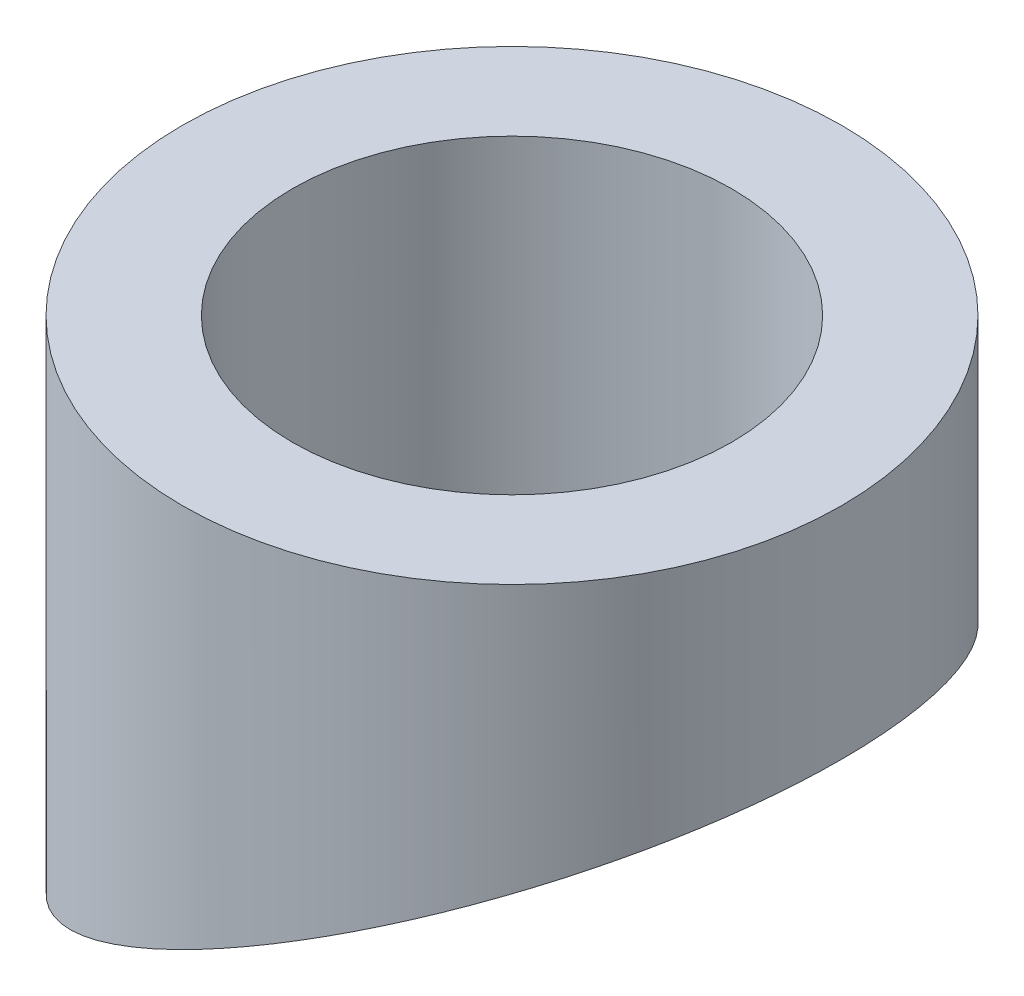
ISO-10303-21;
HEADER;
FILE_DESCRIPTION(('STEP AP214'),'2;1');
FILE_NAME('part.step','',(''),(''),'','','');
FILE_SCHEMA(('AUTOMOTIVE_DESIGN { 1 0 10303 214 1 1 1 1 }'));
ENDSEC;
DATA;
#1=APPLICATION_CONTEXT('core data for automotive mechanical design processes');
#2=APPLICATION_PROTOCOL_DEFINITION('international standard','automotive_design',2000,#1);
#3=PRODUCT_CONTEXT('',#1,'mechanical');
#4=PRODUCT('Part','Part','',(#3));
#5=PRODUCT_RELATED_PRODUCT_CATEGORY('part','',(#4));
#6=PRODUCT_DEFINITION_FORMATION('','',#4);
#7=PRODUCT_DEFINITION_CONTEXT('part definition',#1,'design');
#8=PRODUCT_DEFINITION('design','',#6,#7);
#9=PRODUCT_DEFINITION_SHAPE('','',#8);
#10=(LENGTH_UNIT() NAMED_UNIT(*) SI_UNIT(.MILLI.,.METRE.));
#11=(NAMED_UNIT(*) PLANE_ANGLE_UNIT() SI_UNIT($,.RADIAN.));
#12=(NAMED_UNIT(*) SI_UNIT($,.STERADIAN.) SOLID_ANGLE_UNIT());
#13=UNCERTAINTY_MEASURE_WITH_UNIT(LENGTH_MEASURE(1.E-05),#10,'distance_accuracy_value','');
#14=(GEOMETRIC_REPRESENTATION_CONTEXT(3) GLOBAL_UNCERTAINTY_ASSIGNED_CONTEXT((#13)) GLOBAL_UNIT_ASSIGNED_CONTEXT((#10,
#11,#12)) REPRESENTATION_CONTEXT('',''));
#15=CARTESIAN_POINT('',(0.,0.,0.));
#16=DIRECTION('',(0.,0.,1.));
#17=DIRECTION('',(1.,0.,0.));
#18=AXIS2_PLACEMENT_3D('',#15,#16,#17);
#19=CARTESIAN_POINT('',(0.,15.,0.));
#20=DIRECTION('',(0.,1.,0.));
#21=DIRECTION('',(0.,0.,1.));
#22=AXIS2_PLACEMENT_3D('',#19,#20,#21);
#23=PLANE('',#22);
#24=CARTESIAN_POINT('',(0.,15.,0.));
#25=DIRECTION('',(0.,1.,0.));
#26=DIRECTION('',(0.,0.,1.));
#27=AXIS2_PLACEMENT_3D('',#24,#25,#26);
#28=CIRCLE('',#27,9.);
#29=CARTESIAN_POINT('',(0.,15.,9.));
#30=VERTEX_POINT('',#29);
#31=EDGE_CURVE('E10',#30,#30,#28,.T.);
#32=ORIENTED_EDGE('',*,*,#31,.T.);
#33=EDGE_LOOP('',(#32));
#34=FACE_BOUND('',#33,.T.);
#35=CARTESIAN_POINT('',(0.,15.,0.));
#36=DIRECTION('',(0.,1.,0.));
#37=DIRECTION('',(0.,0.,1.));
#38=AXIS2_PLACEMENT_3D('',#35,#36,#37);
#39=CIRCLE('',#38,6.);
#40=CARTESIAN_POINT('',(0.,15.,6.));
#41=VERTEX_POINT('',#40);
#42=EDGE_CURVE('E46',#41,#41,#39,.T.);
#43=ORIENTED_EDGE('',*,*,#42,.F.);
#44=EDGE_LOOP('',(#43));
#45=FACE_BOUND('',#44,.T.);
#46=ADVANCED_FACE('F37',(#34,#45),#23,.T.);
#47=CARTESIAN_POINT('',(0.,15.,0.));
#48=DIRECTION('',(0.,-1.,0.));
#49=DIRECTION('',(0.,0.,-1.));
#50=AXIS2_PLACEMENT_3D('',#47,#48,#49);
#51=CYLINDRICAL_SURFACE('',#50,9.);
#52=ORIENTED_EDGE('',*,*,#31,.F.);
#53=EDGE_LOOP('',(#52));
#54=FACE_BOUND('',#53,.T.);
#55=CARTESIAN_POINT('',(0.,4.5,0.));
#56=DIRECTION('',(-0.447213595499958,0.894427190999916,0.));
#57=DIRECTION('',(-0.894427190999916,-0.447213595499958,0.));
#58=AXIS2_PLACEMENT_3D('',#55,#56,#57);
#59=ELLIPSE('',#58,10.0623058987491,9.);
#60=CARTESIAN_POINT('',(-9.,0.,0.));
#61=VERTEX_POINT('',#60);
#62=EDGE_CURVE('E51',#61,#61,#59,.T.);
#63=ORIENTED_EDGE('',*,*,#62,.T.);
#64=EDGE_LOOP('',(#63));
#65=FACE_BOUND('',#64,.T.);
#66=ADVANCED_FACE('F39',(#54,#65),#51,.T.);
#67=CARTESIAN_POINT('',(0.,15.,0.));
#68=DIRECTION('',(0.,-1.,0.));
#69=DIRECTION('',(0.,0.,-1.));
#70=AXIS2_PLACEMENT_3D('',#67,#68,#69);
#71=CYLINDRICAL_SURFACE('',#70,6.);
#72=CARTESIAN_POINT('',(0.,4.5,0.));
#73=DIRECTION('',(-0.447213595499958,0.894427190999916,0.));
#74=DIRECTION('',(-0.894427190999916,-0.447213595499958,0.));
#75=AXIS2_PLACEMENT_3D('',#72,#73,#74);
#76=ELLIPSE('',#75,6.70820393249937,6.);
#77=CARTESIAN_POINT('',(-6.,1.5,0.));
#78=VERTEX_POINT('',#77);
#79=EDGE_CURVE('E41',#78,#78,#76,.T.);
#80=ORIENTED_EDGE('',*,*,#79,.F.);
#81=EDGE_LOOP('',(#80));
#82=FACE_BOUND('',#81,.T.);
#83=ORIENTED_EDGE('',*,*,#42,.T.);
#84=EDGE_LOOP('',(#83));
#85=FACE_BOUND('',#84,.T.);
#86=ADVANCED_FACE('F65',(#82,#85),#71,.F.);
#87=CARTESIAN_POINT('',(-9.,0.,-15.));
#88=DIRECTION('',(-0.447213595499958,0.894427190999916,0.));
#89=DIRECTION('',(-0.894427190999916,-0.447213595499958,0.));
#90=AXIS2_PLACEMENT_3D('',#87,#88,#89);
#91=PLANE('',#90);
#92=ORIENTED_EDGE('',*,*,#79,.T.);
#93=EDGE_LOOP('',(#92));
#94=FACE_BOUND('',#93,.T.);
#95=ORIENTED_EDGE('',*,*,#62,.F.);
#96=EDGE_LOOP('',(#95));
#97=FACE_BOUND('',#96,.T.);
#98=ADVANCED_FACE('F62',(#94,#97),#91,.F.);
#99=CLOSED_SHELL('',(#46,#66,#86,#98));
#100=MANIFOLD_SOLID_BREP('B2',#99);
#101=ADVANCED_BREP_SHAPE_REPRESENTATION('',(#18,#100),#14);
#102=SHAPE_DEFINITION_REPRESENTATION(#9,#101);
ENDSEC;
END-ISO-10303-21;
